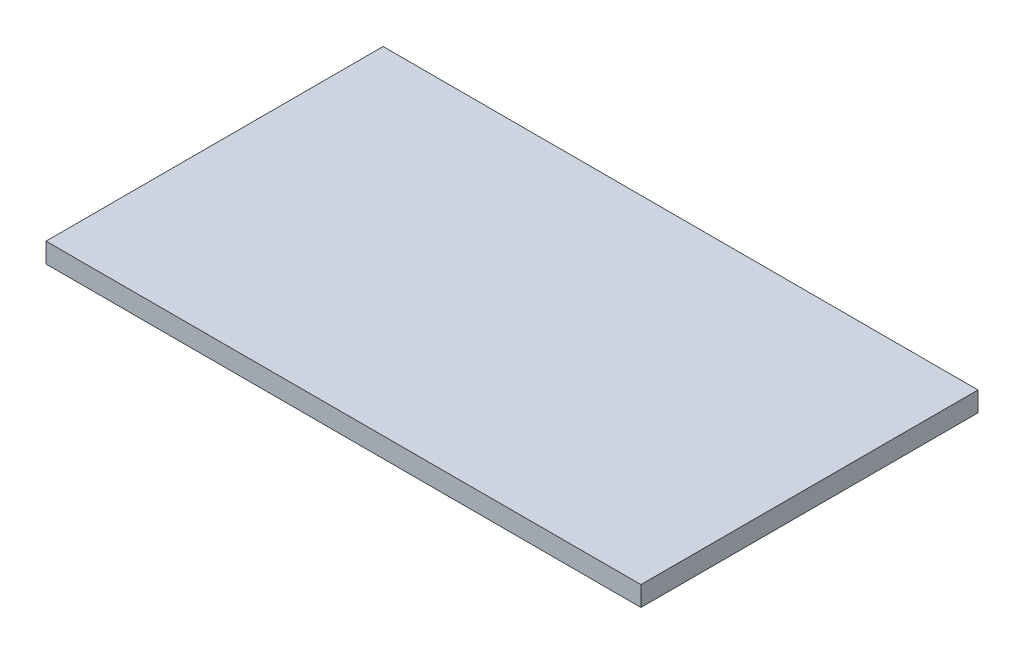
ISO-10303-21;
HEADER;
FILE_DESCRIPTION(('STEP AP214'),'2;1');
FILE_NAME('part.step','',(''),(''),'','','');
FILE_SCHEMA(('AUTOMOTIVE_DESIGN { 1 0 10303 214 1 1 1 1 }'));
ENDSEC;
DATA;
#1=APPLICATION_CONTEXT('core data for automotive mechanical design processes');
#2=APPLICATION_PROTOCOL_DEFINITION('international standard','automotive_design',2000,#1);
#3=PRODUCT_CONTEXT('',#1,'mechanical');
#4=PRODUCT('Part','Part','',(#3));
#5=PRODUCT_RELATED_PRODUCT_CATEGORY('part','',(#4));
#6=PRODUCT_DEFINITION_FORMATION('','',#4);
#7=PRODUCT_DEFINITION_CONTEXT('part definition',#1,'design');
#8=PRODUCT_DEFINITION('design','',#6,#7);
#9=PRODUCT_DEFINITION_SHAPE('','',#8);
#10=(LENGTH_UNIT() NAMED_UNIT(*) SI_UNIT(.MILLI.,.METRE.));
#11=(NAMED_UNIT(*) PLANE_ANGLE_UNIT() SI_UNIT($,.RADIAN.));
#12=(NAMED_UNIT(*) SI_UNIT($,.STERADIAN.) SOLID_ANGLE_UNIT());
#13=UNCERTAINTY_MEASURE_WITH_UNIT(LENGTH_MEASURE(1.E-05),#10,'distance_accuracy_value','');
#14=(GEOMETRIC_REPRESENTATION_CONTEXT(3) GLOBAL_UNCERTAINTY_ASSIGNED_CONTEXT((#13)) GLOBAL_UNIT_ASSIGNED_CONTEXT((#10,
#11,#12)) REPRESENTATION_CONTEXT('',''));
#15=CARTESIAN_POINT('',(0.,0.,0.));
#16=DIRECTION('',(0.,0.,1.));
#17=DIRECTION('',(1.,0.,0.));
#18=AXIS2_PLACEMENT_3D('',#15,#16,#17);
#19=CARTESIAN_POINT('',(150.,10.,85.));
#20=DIRECTION('',(-1.,0.,0.));
#21=DIRECTION('',(0.,0.,1.));
#22=AXIS2_PLACEMENT_3D('',#19,#20,#21);
#23=PLANE('',#22);
#24=DIRECTION('',(0.,0.,-1.));
#25=VECTOR('',#24,1.);
#26=CARTESIAN_POINT('',(150.,0.,85.));
#27=LINE('',#26,#25);
#28=CARTESIAN_POINT('',(150.,0.,85.));
#29=VERTEX_POINT('',#28);
#30=CARTESIAN_POINT('',(150.,0.,-85.));
#31=VERTEX_POINT('',#30);
#32=EDGE_CURVE('E96',#29,#31,#27,.T.);
#33=ORIENTED_EDGE('',*,*,#32,.T.);
#34=DIRECTION('',(0.,-1.,0.));
#35=VECTOR('',#34,1.);
#36=CARTESIAN_POINT('',(150.,10.,-85.));
#37=LINE('',#36,#35);
#38=CARTESIAN_POINT('',(150.,10.,-85.));
#39=VERTEX_POINT('',#38);
#40=EDGE_CURVE('E11',#39,#31,#37,.T.);
#41=ORIENTED_EDGE('',*,*,#40,.F.);
#42=DIRECTION('',(0.,0.,-1.));
#43=VECTOR('',#42,1.);
#44=CARTESIAN_POINT('',(150.,10.,85.));
#45=LINE('',#44,#43);
#46=CARTESIAN_POINT('',(150.,10.,85.));
#47=VERTEX_POINT('',#46);
#48=EDGE_CURVE('E84',#47,#39,#45,.T.);
#49=ORIENTED_EDGE('',*,*,#48,.F.);
#50=DIRECTION('',(0.,-1.,0.));
#51=VECTOR('',#50,1.);
#52=CARTESIAN_POINT('',(150.,10.,85.));
#53=LINE('',#52,#51);
#54=EDGE_CURVE('E92',#47,#29,#53,.T.);
#55=ORIENTED_EDGE('',*,*,#54,.T.);
#56=EDGE_LOOP('',(#33,#41,#49,#55));
#57=FACE_BOUND('',#56,.T.);
#58=ADVANCED_FACE('F33',(#57),#23,.F.);
#59=CARTESIAN_POINT('',(-150.,10.,-85.));
#60=DIRECTION('',(0.,0.,1.));
#61=DIRECTION('',(1.,0.,0.));
#62=AXIS2_PLACEMENT_3D('',#59,#60,#61);
#63=PLANE('',#62);
#64=DIRECTION('',(-1.,0.,0.));
#65=VECTOR('',#64,1.);
#66=CARTESIAN_POINT('',(-150.,0.,-85.));
#67=LINE('',#66,#65);
#68=CARTESIAN_POINT('',(-150.,0.,-85.));
#69=VERTEX_POINT('',#68);
#70=EDGE_CURVE('E88',#31,#69,#67,.T.);
#71=ORIENTED_EDGE('',*,*,#70,.T.);
#72=DIRECTION('',(0.,-1.,0.));
#73=VECTOR('',#72,1.);
#74=CARTESIAN_POINT('',(-150.,10.,-85.));
#75=LINE('',#74,#73);
#76=CARTESIAN_POINT('',(-150.,10.,-85.));
#77=VERTEX_POINT('',#76);
#78=EDGE_CURVE('E41',#77,#69,#75,.T.);
#79=ORIENTED_EDGE('',*,*,#78,.F.);
#80=DIRECTION('',(-1.,0.,0.));
#81=VECTOR('',#80,1.);
#82=CARTESIAN_POINT('',(-150.,10.,-85.));
#83=LINE('',#82,#81);
#84=EDGE_CURVE('E79',#39,#77,#83,.T.);
#85=ORIENTED_EDGE('',*,*,#84,.F.);
#86=ORIENTED_EDGE('',*,*,#40,.T.);
#87=EDGE_LOOP('',(#71,#79,#85,#86));
#88=FACE_BOUND('',#87,.T.);
#89=ADVANCED_FACE('F87',(#88),#63,.F.);
#90=CARTESIAN_POINT('',(-150.,10.,85.));
#91=DIRECTION('',(1.,0.,0.));
#92=DIRECTION('',(0.,0.,-1.));
#93=AXIS2_PLACEMENT_3D('',#90,#91,#92);
#94=PLANE('',#93);
#95=DIRECTION('',(0.,0.,1.));
#96=VECTOR('',#95,1.);
#97=CARTESIAN_POINT('',(-150.,0.,85.));
#98=LINE('',#97,#96);
#99=CARTESIAN_POINT('',(-150.,0.,85.));
#100=VERTEX_POINT('',#99);
#101=EDGE_CURVE('E66',#69,#100,#98,.T.);
#102=ORIENTED_EDGE('',*,*,#101,.T.);
#103=DIRECTION('',(0.,-1.,0.));
#104=VECTOR('',#103,1.);
#105=CARTESIAN_POINT('',(-150.,10.,85.));
#106=LINE('',#105,#104);
#107=CARTESIAN_POINT('',(-150.,10.,85.));
#108=VERTEX_POINT('',#107);
#109=EDGE_CURVE('E89',#108,#100,#106,.T.);
#110=ORIENTED_EDGE('',*,*,#109,.F.);
#111=DIRECTION('',(0.,0.,1.));
#112=VECTOR('',#111,1.);
#113=CARTESIAN_POINT('',(-150.,10.,85.));
#114=LINE('',#113,#112);
#115=EDGE_CURVE('E82',#77,#108,#114,.T.);
#116=ORIENTED_EDGE('',*,*,#115,.F.);
#117=ORIENTED_EDGE('',*,*,#78,.T.);
#118=EDGE_LOOP('',(#102,#110,#116,#117));
#119=FACE_BOUND('',#118,.T.);
#120=ADVANCED_FACE('F90',(#119),#94,.F.);
#121=CARTESIAN_POINT('',(-150.,10.,85.));
#122=DIRECTION('',(0.,0.,-1.));
#123=DIRECTION('',(-1.,0.,0.));
#124=AXIS2_PLACEMENT_3D('',#121,#122,#123);
#125=PLANE('',#124);
#126=DIRECTION('',(1.,0.,0.));
#127=VECTOR('',#126,1.);
#128=CARTESIAN_POINT('',(-150.,0.,85.));
#129=LINE('',#128,#127);
#130=EDGE_CURVE('E72',#100,#29,#129,.T.);
#131=ORIENTED_EDGE('',*,*,#130,.T.);
#132=ORIENTED_EDGE('',*,*,#54,.F.);
#133=DIRECTION('',(1.,0.,0.));
#134=VECTOR('',#133,1.);
#135=CARTESIAN_POINT('',(-150.,10.,85.));
#136=LINE('',#135,#134);
#137=EDGE_CURVE('E49',#108,#47,#136,.T.);
#138=ORIENTED_EDGE('',*,*,#137,.F.);
#139=ORIENTED_EDGE('',*,*,#109,.T.);
#140=EDGE_LOOP('',(#131,#132,#138,#139));
#141=FACE_BOUND('',#140,.T.);
#142=ADVANCED_FACE('F103',(#141),#125,.F.);
#143=CARTESIAN_POINT('',(0.,10.,0.));
#144=DIRECTION('',(0.,-1.,0.));
#145=DIRECTION('',(0.,0.,-1.));
#146=AXIS2_PLACEMENT_3D('',#143,#144,#145);
#147=PLANE('',#146);
#148=ORIENTED_EDGE('',*,*,#48,.T.);
#149=ORIENTED_EDGE('',*,*,#84,.T.);
#150=ORIENTED_EDGE('',*,*,#115,.T.);
#151=ORIENTED_EDGE('',*,*,#137,.T.);
#152=EDGE_LOOP('',(#148,#149,#150,#151));
#153=FACE_BOUND('',#152,.T.);
#154=ADVANCED_FACE('F80',(#153),#147,.F.);
#155=CARTESIAN_POINT('',(0.,0.,0.));
#156=DIRECTION('',(0.,-1.,0.));
#157=DIRECTION('',(0.,0.,-1.));
#158=AXIS2_PLACEMENT_3D('',#155,#156,#157);
#159=PLANE('',#158);
#160=ORIENTED_EDGE('',*,*,#32,.F.);
#161=ORIENTED_EDGE('',*,*,#130,.F.);
#162=ORIENTED_EDGE('',*,*,#101,.F.);
#163=ORIENTED_EDGE('',*,*,#70,.F.);
#164=EDGE_LOOP('',(#160,#161,#162,#163));
#165=FACE_BOUND('',#164,.T.);
#166=ADVANCED_FACE('F106',(#165),#159,.T.);
#167=CLOSED_SHELL('',(#58,#89,#120,#142,#154,#166));
#168=MANIFOLD_SOLID_BREP('B2',#167);
#169=ADVANCED_BREP_SHAPE_REPRESENTATION('',(#18,#168),#14);
#170=SHAPE_DEFINITION_REPRESENTATION(#9,#169);
ENDSEC;
END-ISO-10303-21;
